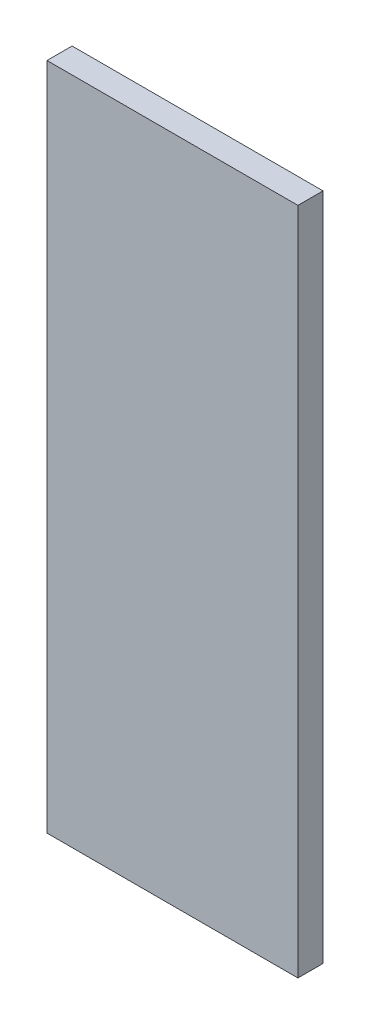
ISO-10303-21;
HEADER;
FILE_DESCRIPTION(('STEP AP214'),'2;1');
FILE_NAME('part.step','',(''),(''),'','','');
FILE_SCHEMA(('AUTOMOTIVE_DESIGN { 1 0 10303 214 1 1 1 1 }'));
ENDSEC;
DATA;
#1=APPLICATION_CONTEXT('core data for automotive mechanical design processes');
#2=APPLICATION_PROTOCOL_DEFINITION('international standard','automotive_design',2000,#1);
#3=PRODUCT_CONTEXT('',#1,'mechanical');
#4=PRODUCT('Part','Part','',(#3));
#5=PRODUCT_RELATED_PRODUCT_CATEGORY('part','',(#4));
#6=PRODUCT_DEFINITION_FORMATION('','',#4);
#7=PRODUCT_DEFINITION_CONTEXT('part definition',#1,'design');
#8=PRODUCT_DEFINITION('design','',#6,#7);
#9=PRODUCT_DEFINITION_SHAPE('','',#8);
#10=(LENGTH_UNIT() NAMED_UNIT(*) SI_UNIT(.MILLI.,.METRE.));
#11=(NAMED_UNIT(*) PLANE_ANGLE_UNIT() SI_UNIT($,.RADIAN.));
#12=(NAMED_UNIT(*) SI_UNIT($,.STERADIAN.) SOLID_ANGLE_UNIT());
#13=UNCERTAINTY_MEASURE_WITH_UNIT(LENGTH_MEASURE(1.E-05),#10,'distance_accuracy_value','');
#14=(GEOMETRIC_REPRESENTATION_CONTEXT(3) GLOBAL_UNCERTAINTY_ASSIGNED_CONTEXT((#13)) GLOBAL_UNIT_ASSIGNED_CONTEXT((#10,
#11,#12)) REPRESENTATION_CONTEXT('',''));
#15=CARTESIAN_POINT('',(0.,0.,0.));
#16=DIRECTION('',(0.,0.,1.));
#17=DIRECTION('',(1.,0.,0.));
#18=AXIS2_PLACEMENT_3D('',#15,#16,#17);
#19=CARTESIAN_POINT('',(17.7966101694915,140.677966101695,3.));
#20=DIRECTION('',(-1.,0.,0.));
#21=DIRECTION('',(0.,-1.,0.));
#22=AXIS2_PLACEMENT_3D('',#19,#20,#21);
#23=PLANE('',#22);
#24=DIRECTION('',(0.,1.,0.));
#25=VECTOR('',#24,1.);
#26=CARTESIAN_POINT('',(17.7966101694915,140.677966101695,0.));
#27=LINE('',#26,#25);
#28=CARTESIAN_POINT('',(17.7966101694915,60.677966101695,0.));
#29=VERTEX_POINT('',#28);
#30=CARTESIAN_POINT('',(17.7966101694915,140.677966101695,0.));
#31=VERTEX_POINT('',#30);
#32=EDGE_CURVE('E109',#29,#31,#27,.T.);
#33=ORIENTED_EDGE('',*,*,#32,.T.);
#34=DIRECTION('',(0.,0.,-1.));
#35=VECTOR('',#34,1.);
#36=CARTESIAN_POINT('',(17.7966101694915,140.677966101695,3.));
#37=LINE('',#36,#35);
#38=CARTESIAN_POINT('',(17.7966101694915,140.677966101695,3.));
#39=VERTEX_POINT('',#38);
#40=EDGE_CURVE('E11',#39,#31,#37,.T.);
#41=ORIENTED_EDGE('',*,*,#40,.F.);
#42=DIRECTION('',(0.,1.,0.));
#43=VECTOR('',#42,1.);
#44=CARTESIAN_POINT('',(17.7966101694915,140.677966101695,3.));
#45=LINE('',#44,#43);
#46=CARTESIAN_POINT('',(17.7966101694915,60.677966101695,3.));
#47=VERTEX_POINT('',#46);
#48=EDGE_CURVE('E93',#47,#39,#45,.T.);
#49=ORIENTED_EDGE('',*,*,#48,.F.);
#50=DIRECTION('',(0.,0.,-1.));
#51=VECTOR('',#50,1.);
#52=CARTESIAN_POINT('',(17.7966101694915,60.677966101695,3.));
#53=LINE('',#52,#51);
#54=EDGE_CURVE('E105',#47,#29,#53,.T.);
#55=ORIENTED_EDGE('',*,*,#54,.T.);
#56=EDGE_LOOP('',(#33,#41,#49,#55));
#57=FACE_BOUND('',#56,.T.);
#58=ADVANCED_FACE('F41',(#57),#23,.F.);
#59=CARTESIAN_POINT('',(-12.2033898305085,140.677966101695,3.));
#60=DIRECTION('',(0.,-1.,0.));
#61=DIRECTION('',(0.,0.,-1.));
#62=AXIS2_PLACEMENT_3D('',#59,#60,#61);
#63=PLANE('',#62);
#64=DIRECTION('',(-1.,0.,0.));
#65=VECTOR('',#64,1.);
#66=CARTESIAN_POINT('',(-12.2033898305085,140.677966101695,0.));
#67=LINE('',#66,#65);
#68=CARTESIAN_POINT('',(-12.2033898305085,140.677966101695,0.));
#69=VERTEX_POINT('',#68);
#70=EDGE_CURVE('E98',#31,#69,#67,.T.);
#71=ORIENTED_EDGE('',*,*,#70,.T.);
#72=DIRECTION('',(0.,0.,-1.));
#73=VECTOR('',#72,1.);
#74=CARTESIAN_POINT('',(-12.2033898305085,140.677966101695,3.));
#75=LINE('',#74,#73);
#76=CARTESIAN_POINT('',(-12.2033898305085,140.677966101695,3.));
#77=VERTEX_POINT('',#76);
#78=EDGE_CURVE('E50',#77,#69,#75,.T.);
#79=ORIENTED_EDGE('',*,*,#78,.F.);
#80=DIRECTION('',(-1.,0.,0.));
#81=VECTOR('',#80,1.);
#82=CARTESIAN_POINT('',(-12.2033898305085,140.677966101695,3.));
#83=LINE('',#82,#81);
#84=EDGE_CURVE('E88',#39,#77,#83,.T.);
#85=ORIENTED_EDGE('',*,*,#84,.F.);
#86=ORIENTED_EDGE('',*,*,#40,.T.);
#87=EDGE_LOOP('',(#71,#79,#85,#86));
#88=FACE_BOUND('',#87,.T.);
#89=ADVANCED_FACE('F97',(#88),#63,.F.);
#90=CARTESIAN_POINT('',(-12.2033898305085,140.677966101695,3.));
#91=DIRECTION('',(1.,0.,0.));
#92=DIRECTION('',(0.,0.,-1.));
#93=AXIS2_PLACEMENT_3D('',#90,#91,#92);
#94=PLANE('',#93);
#95=DIRECTION('',(0.,-1.,0.));
#96=VECTOR('',#95,1.);
#97=CARTESIAN_POINT('',(-12.2033898305085,140.677966101695,0.));
#98=LINE('',#97,#96);
#99=CARTESIAN_POINT('',(-12.2033898305085,60.677966101695,0.));
#100=VERTEX_POINT('',#99);
#101=EDGE_CURVE('E75',#69,#100,#98,.T.);
#102=ORIENTED_EDGE('',*,*,#101,.T.);
#103=DIRECTION('',(0.,0.,-1.));
#104=VECTOR('',#103,1.);
#105=CARTESIAN_POINT('',(-12.2033898305085,60.677966101695,3.));
#106=LINE('',#105,#104);
#107=CARTESIAN_POINT('',(-12.2033898305085,60.677966101695,3.));
#108=VERTEX_POINT('',#107);
#109=EDGE_CURVE('E100',#108,#100,#106,.T.);
#110=ORIENTED_EDGE('',*,*,#109,.F.);
#111=DIRECTION('',(0.,-1.,0.));
#112=VECTOR('',#111,1.);
#113=CARTESIAN_POINT('',(-12.2033898305085,140.677966101695,3.));
#114=LINE('',#113,#112);
#115=EDGE_CURVE('E91',#77,#108,#114,.T.);
#116=ORIENTED_EDGE('',*,*,#115,.F.);
#117=ORIENTED_EDGE('',*,*,#78,.T.);
#118=EDGE_LOOP('',(#102,#110,#116,#117));
#119=FACE_BOUND('',#118,.T.);
#120=ADVANCED_FACE('F101',(#119),#94,.F.);
#121=CARTESIAN_POINT('',(-12.2033898305085,60.677966101695,3.));
#122=DIRECTION('',(0.,1.,0.));
#123=DIRECTION('',(0.,0.,1.));
#124=AXIS2_PLACEMENT_3D('',#121,#122,#123);
#125=PLANE('',#124);
#126=DIRECTION('',(1.,0.,0.));
#127=VECTOR('',#126,1.);
#128=CARTESIAN_POINT('',(-12.2033898305085,60.677966101695,0.));
#129=LINE('',#128,#127);
#130=EDGE_CURVE('E81',#100,#29,#129,.T.);
#131=ORIENTED_EDGE('',*,*,#130,.T.);
#132=ORIENTED_EDGE('',*,*,#54,.F.);
#133=DIRECTION('',(1.,0.,0.));
#134=VECTOR('',#133,1.);
#135=CARTESIAN_POINT('',(-12.2033898305085,60.677966101695,3.));
#136=LINE('',#135,#134);
#137=EDGE_CURVE('E58',#108,#47,#136,.T.);
#138=ORIENTED_EDGE('',*,*,#137,.F.);
#139=ORIENTED_EDGE('',*,*,#109,.T.);
#140=EDGE_LOOP('',(#131,#132,#138,#139));
#141=FACE_BOUND('',#140,.T.);
#142=ADVANCED_FACE('F122',(#141),#125,.F.);
#143=CARTESIAN_POINT('',(0.,0.,3.));
#144=DIRECTION('',(0.,0.,1.));
#145=DIRECTION('',(1.,0.,0.));
#146=AXIS2_PLACEMENT_3D('',#143,#144,#145);
#147=PLANE('',#146);
#148=ORIENTED_EDGE('',*,*,#48,.T.);
#149=ORIENTED_EDGE('',*,*,#84,.T.);
#150=ORIENTED_EDGE('',*,*,#115,.T.);
#151=ORIENTED_EDGE('',*,*,#137,.T.);
#152=EDGE_LOOP('',(#148,#149,#150,#151));
#153=FACE_BOUND('',#152,.T.);
#154=ADVANCED_FACE('F89',(#153),#147,.T.);
#155=CARTESIAN_POINT('',(0.,0.,0.));
#156=DIRECTION('',(0.,0.,1.));
#157=DIRECTION('',(1.,0.,0.));
#158=AXIS2_PLACEMENT_3D('',#155,#156,#157);
#159=PLANE('',#158);
#160=ORIENTED_EDGE('',*,*,#32,.F.);
#161=ORIENTED_EDGE('',*,*,#130,.F.);
#162=ORIENTED_EDGE('',*,*,#101,.F.);
#163=ORIENTED_EDGE('',*,*,#70,.F.);
#164=EDGE_LOOP('',(#160,#161,#162,#163));
#165=FACE_BOUND('',#164,.T.);
#166=ADVANCED_FACE('F125',(#165),#159,.F.);
#167=CLOSED_SHELL('',(#58,#89,#120,#142,#154,#166));
#168=MANIFOLD_SOLID_BREP('B2',#167);
#169=ADVANCED_BREP_SHAPE_REPRESENTATION('',(#18,#168),#14);
#170=SHAPE_DEFINITION_REPRESENTATION(#9,#169);
ENDSEC;
END-ISO-10303-21;
